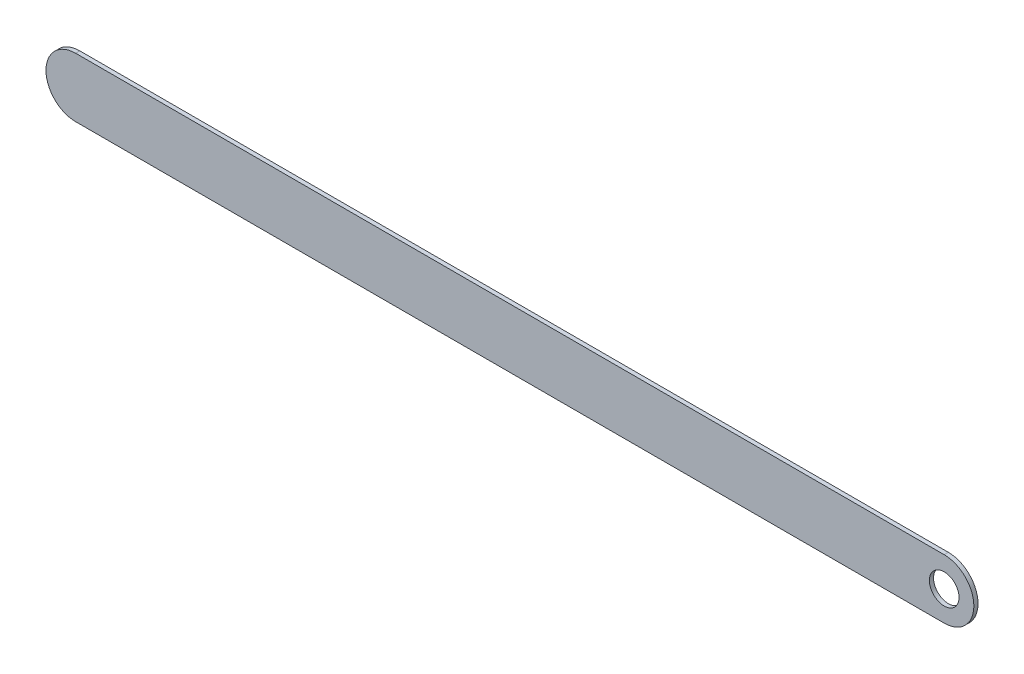
ISO-10303-21;
HEADER;
FILE_DESCRIPTION(('STEP AP214'),'2;1');
FILE_NAME('part.step','',(''),(''),'','','');
FILE_SCHEMA(('AUTOMOTIVE_DESIGN { 1 0 10303 214 1 1 1 1 }'));
ENDSEC;
DATA;
#1=APPLICATION_CONTEXT('core data for automotive mechanical design processes');
#2=APPLICATION_PROTOCOL_DEFINITION('international standard','automotive_design',2000,#1);
#3=PRODUCT_CONTEXT('',#1,'mechanical');
#4=PRODUCT('Part','Part','',(#3));
#5=PRODUCT_RELATED_PRODUCT_CATEGORY('part','',(#4));
#6=PRODUCT_DEFINITION_FORMATION('','',#4);
#7=PRODUCT_DEFINITION_CONTEXT('part definition',#1,'design');
#8=PRODUCT_DEFINITION('design','',#6,#7);
#9=PRODUCT_DEFINITION_SHAPE('','',#8);
#10=(LENGTH_UNIT() NAMED_UNIT(*) SI_UNIT(.MILLI.,.METRE.));
#11=(NAMED_UNIT(*) PLANE_ANGLE_UNIT() SI_UNIT($,.RADIAN.));
#12=(NAMED_UNIT(*) SI_UNIT($,.STERADIAN.) SOLID_ANGLE_UNIT());
#13=UNCERTAINTY_MEASURE_WITH_UNIT(LENGTH_MEASURE(1.E-05),#10,'distance_accuracy_value','');
#14=(GEOMETRIC_REPRESENTATION_CONTEXT(3) GLOBAL_UNCERTAINTY_ASSIGNED_CONTEXT((#13)) GLOBAL_UNIT_ASSIGNED_CONTEXT((#10,
#11,#12)) REPRESENTATION_CONTEXT('',''));
#15=CARTESIAN_POINT('',(0.,0.,0.));
#16=DIRECTION('',(0.,0.,1.));
#17=DIRECTION('',(1.,0.,0.));
#18=AXIS2_PLACEMENT_3D('',#15,#16,#17);
#19=CARTESIAN_POINT('',(89.15,-117.825,-0.045));
#20=DIRECTION('',(0.,0.,-1.));
#21=DIRECTION('',(0.,-1.,0.));
#22=AXIS2_PLACEMENT_3D('',#19,#20,#21);
#23=CYLINDRICAL_SURFACE('',#22,0.125);
#24=CARTESIAN_POINT('',(89.15,-117.825,-0.035));
#25=DIRECTION('',(0.,0.,-1.));
#26=DIRECTION('',(0.,-1.,0.));
#27=AXIS2_PLACEMENT_3D('',#24,#25,#26);
#28=CIRCLE('',#27,0.125);
#29=CARTESIAN_POINT('',(89.15,-117.95,-0.035));
#30=VERTEX_POINT('',#29);
#31=EDGE_CURVE('E82',#30,#30,#28,.T.);
#32=ORIENTED_EDGE('',*,*,#31,.T.);
#33=DIRECTION('',(0.,0.,1.));
#34=VECTOR('',#33,1.);
#35=CARTESIAN_POINT('',(89.15,-117.95,-0.045));
#36=LINE('',#35,#34);
#37=CARTESIAN_POINT('',(89.15,-117.95,0.));
#38=VERTEX_POINT('',#37);
#39=EDGE_CURVE('E11',#30,#38,#36,.T.);
#40=ORIENTED_EDGE('',*,*,#39,.T.);
#41=CARTESIAN_POINT('',(89.15,-117.825,0.));
#42=DIRECTION('',(0.,0.,-1.));
#43=DIRECTION('',(0.,-1.,0.));
#44=AXIS2_PLACEMENT_3D('',#41,#42,#43);
#45=CIRCLE('',#44,0.125);
#46=EDGE_CURVE('E21',#38,#38,#45,.T.);
#47=ORIENTED_EDGE('',*,*,#46,.F.);
#48=ORIENTED_EDGE('',*,*,#39,.F.);
#49=EDGE_LOOP('',(#32,#40,#47,#48));
#50=FACE_BOUND('',#49,.T.);
#51=ADVANCED_FACE('F17',(#50),#23,.F.);
#52=CARTESIAN_POINT('',(89.15,-117.575,-0.035));
#53=DIRECTION('',(0.,-1.,0.));
#54=DIRECTION('',(0.,0.,-1.));
#55=AXIS2_PLACEMENT_3D('',#52,#53,#54);
#56=PLANE('',#55);
#57=DIRECTION('',(-1.,0.,0.));
#58=VECTOR('',#57,1.);
#59=CARTESIAN_POINT('',(89.15,-117.575,-0.035));
#60=LINE('',#59,#58);
#61=CARTESIAN_POINT('',(89.15,-117.575,-0.035));
#62=VERTEX_POINT('',#61);
#63=CARTESIAN_POINT('',(81.825,-117.575,-0.035));
#64=VERTEX_POINT('',#63);
#65=EDGE_CURVE('E68',#62,#64,#60,.T.);
#66=ORIENTED_EDGE('',*,*,#65,.T.);
#67=DIRECTION('',(0.,0.,1.));
#68=VECTOR('',#67,1.);
#69=CARTESIAN_POINT('',(81.825,-117.575,-0.035));
#70=LINE('',#69,#68);
#71=CARTESIAN_POINT('',(81.825,-117.575,0.));
#72=VERTEX_POINT('',#71);
#73=EDGE_CURVE('E98',#64,#72,#70,.T.);
#74=ORIENTED_EDGE('',*,*,#73,.T.);
#75=DIRECTION('',(-1.,0.,0.));
#76=VECTOR('',#75,1.);
#77=CARTESIAN_POINT('',(89.15,-117.575,0.));
#78=LINE('',#77,#76);
#79=CARTESIAN_POINT('',(89.15,-117.575,0.));
#80=VERTEX_POINT('',#79);
#81=EDGE_CURVE('E87',#80,#72,#78,.T.);
#82=ORIENTED_EDGE('',*,*,#81,.F.);
#83=DIRECTION('',(0.,0.,1.));
#84=VECTOR('',#83,1.);
#85=CARTESIAN_POINT('',(89.15,-117.575,-0.035));
#86=LINE('',#85,#84);
#87=EDGE_CURVE('E86',#62,#80,#86,.T.);
#88=ORIENTED_EDGE('',*,*,#87,.F.);
#89=EDGE_LOOP('',(#66,#74,#82,#88));
#90=FACE_BOUND('',#89,.T.);
#91=ADVANCED_FACE('F19',(#90),#56,.F.);
#92=CARTESIAN_POINT('',(81.825,-118.075,0.));
#93=DIRECTION('',(0.,0.,1.));
#94=DIRECTION('',(1.,0.,0.));
#95=AXIS2_PLACEMENT_3D('',#92,#93,#94);
#96=PLANE('',#95);
#97=ORIENTED_EDGE('',*,*,#46,.T.);
#98=EDGE_LOOP('',(#97));
#99=FACE_BOUND('',#98,.T.);
#100=DIRECTION('',(1.,0.,0.));
#101=VECTOR('',#100,1.);
#102=CARTESIAN_POINT('',(81.825,-118.075,0.));
#103=LINE('',#102,#101);
#104=CARTESIAN_POINT('',(81.825,-118.075,0.));
#105=VERTEX_POINT('',#104);
#106=CARTESIAN_POINT('',(89.15,-118.075,0.));
#107=VERTEX_POINT('',#106);
#108=EDGE_CURVE('E120',#105,#107,#103,.T.);
#109=ORIENTED_EDGE('',*,*,#108,.T.);
#110=CARTESIAN_POINT('',(89.15,-117.825,0.));
#111=DIRECTION('',(0.,0.,1.));
#112=DIRECTION('',(0.,-1.,0.));
#113=AXIS2_PLACEMENT_3D('',#110,#111,#112);
#114=CIRCLE('',#113,0.25);
#115=EDGE_CURVE('E83',#107,#80,#114,.T.);
#116=ORIENTED_EDGE('',*,*,#115,.T.);
#117=ORIENTED_EDGE('',*,*,#81,.T.);
#118=CARTESIAN_POINT('',(81.825,-117.825,0.));
#119=DIRECTION('',(0.,0.,1.));
#120=DIRECTION('',(0.,1.,0.));
#121=AXIS2_PLACEMENT_3D('',#118,#119,#120);
#122=CIRCLE('',#121,0.25);
#123=EDGE_CURVE('E104',#72,#105,#122,.T.);
#124=ORIENTED_EDGE('',*,*,#123,.T.);
#125=EDGE_LOOP('',(#109,#116,#117,#124));
#126=FACE_BOUND('',#125,.T.);
#127=ADVANCED_FACE('F162',(#99,#126),#96,.T.);
#128=CARTESIAN_POINT('',(81.825,-118.075,-0.035));
#129=DIRECTION('',(0.,0.,1.));
#130=DIRECTION('',(1.,0.,0.));
#131=AXIS2_PLACEMENT_3D('',#128,#129,#130);
#132=PLANE('',#131);
#133=ORIENTED_EDGE('',*,*,#31,.F.);
#134=EDGE_LOOP('',(#133));
#135=FACE_BOUND('',#134,.T.);
#136=CARTESIAN_POINT('',(81.825,-117.825,-0.035));
#137=DIRECTION('',(0.,0.,1.));
#138=DIRECTION('',(0.,1.,0.));
#139=AXIS2_PLACEMENT_3D('',#136,#137,#138);
#140=CIRCLE('',#139,0.25);
#141=CARTESIAN_POINT('',(81.825,-118.075,-0.035));
#142=VERTEX_POINT('',#141);
#143=EDGE_CURVE('E77',#64,#142,#140,.T.);
#144=ORIENTED_EDGE('',*,*,#143,.F.);
#145=ORIENTED_EDGE('',*,*,#65,.F.);
#146=CARTESIAN_POINT('',(89.15,-117.825,-0.035));
#147=DIRECTION('',(0.,0.,1.));
#148=DIRECTION('',(0.,-1.,0.));
#149=AXIS2_PLACEMENT_3D('',#146,#147,#148);
#150=CIRCLE('',#149,0.25);
#151=CARTESIAN_POINT('',(89.15,-118.075,-0.035));
#152=VERTEX_POINT('',#151);
#153=EDGE_CURVE('E74',#152,#62,#150,.T.);
#154=ORIENTED_EDGE('',*,*,#153,.F.);
#155=DIRECTION('',(1.,0.,0.));
#156=VECTOR('',#155,1.);
#157=CARTESIAN_POINT('',(81.825,-118.075,-0.035));
#158=LINE('',#157,#156);
#159=EDGE_CURVE('E140',#142,#152,#158,.T.);
#160=ORIENTED_EDGE('',*,*,#159,.F.);
#161=EDGE_LOOP('',(#144,#145,#154,#160));
#162=FACE_BOUND('',#161,.T.);
#163=ADVANCED_FACE('F70',(#135,#162),#132,.F.);
#164=CARTESIAN_POINT('',(89.15,-117.825,-0.035));
#165=DIRECTION('',(0.,0.,-1.));
#166=DIRECTION('',(0.,-1.,0.));
#167=AXIS2_PLACEMENT_3D('',#164,#165,#166);
#168=CYLINDRICAL_SURFACE('',#167,0.25);
#169=ORIENTED_EDGE('',*,*,#153,.T.);
#170=ORIENTED_EDGE('',*,*,#87,.T.);
#171=ORIENTED_EDGE('',*,*,#115,.F.);
#172=DIRECTION('',(0.,0.,1.));
#173=VECTOR('',#172,1.);
#174=CARTESIAN_POINT('',(89.15,-118.075,-0.035));
#175=LINE('',#174,#173);
#176=EDGE_CURVE('E95',#152,#107,#175,.T.);
#177=ORIENTED_EDGE('',*,*,#176,.F.);
#178=EDGE_LOOP('',(#169,#170,#171,#177));
#179=FACE_BOUND('',#178,.T.);
#180=ADVANCED_FACE('F93',(#179),#168,.T.);
#181=CARTESIAN_POINT('',(81.825,-117.825,-0.035));
#182=DIRECTION('',(0.,0.,-1.));
#183=DIRECTION('',(0.,1.,0.));
#184=AXIS2_PLACEMENT_3D('',#181,#182,#183);
#185=CYLINDRICAL_SURFACE('',#184,0.25);
#186=ORIENTED_EDGE('',*,*,#143,.T.);
#187=DIRECTION('',(0.,0.,1.));
#188=VECTOR('',#187,1.);
#189=CARTESIAN_POINT('',(81.825,-118.075,-0.035));
#190=LINE('',#189,#188);
#191=EDGE_CURVE('E124',#142,#105,#190,.T.);
#192=ORIENTED_EDGE('',*,*,#191,.T.);
#193=ORIENTED_EDGE('',*,*,#123,.F.);
#194=ORIENTED_EDGE('',*,*,#73,.F.);
#195=EDGE_LOOP('',(#186,#192,#193,#194));
#196=FACE_BOUND('',#195,.T.);
#197=ADVANCED_FACE('F181',(#196),#185,.T.);
#198=CARTESIAN_POINT('',(81.825,-118.075,-0.035));
#199=DIRECTION('',(0.,1.,0.));
#200=DIRECTION('',(1.,0.,0.));
#201=AXIS2_PLACEMENT_3D('',#198,#199,#200);
#202=PLANE('',#201);
#203=ORIENTED_EDGE('',*,*,#159,.T.);
#204=ORIENTED_EDGE('',*,*,#176,.T.);
#205=ORIENTED_EDGE('',*,*,#108,.F.);
#206=ORIENTED_EDGE('',*,*,#191,.F.);
#207=EDGE_LOOP('',(#203,#204,#205,#206));
#208=FACE_BOUND('',#207,.T.);
#209=ADVANCED_FACE('F149',(#208),#202,.F.);
#210=CLOSED_SHELL('',(#51,#91,#127,#163,#180,#197,#209));
#211=MANIFOLD_SOLID_BREP('B1',#210);
#212=ADVANCED_BREP_SHAPE_REPRESENTATION('',(#18,#211),#14);
#213=SHAPE_DEFINITION_REPRESENTATION(#9,#212);
ENDSEC;
END-ISO-10303-21;
